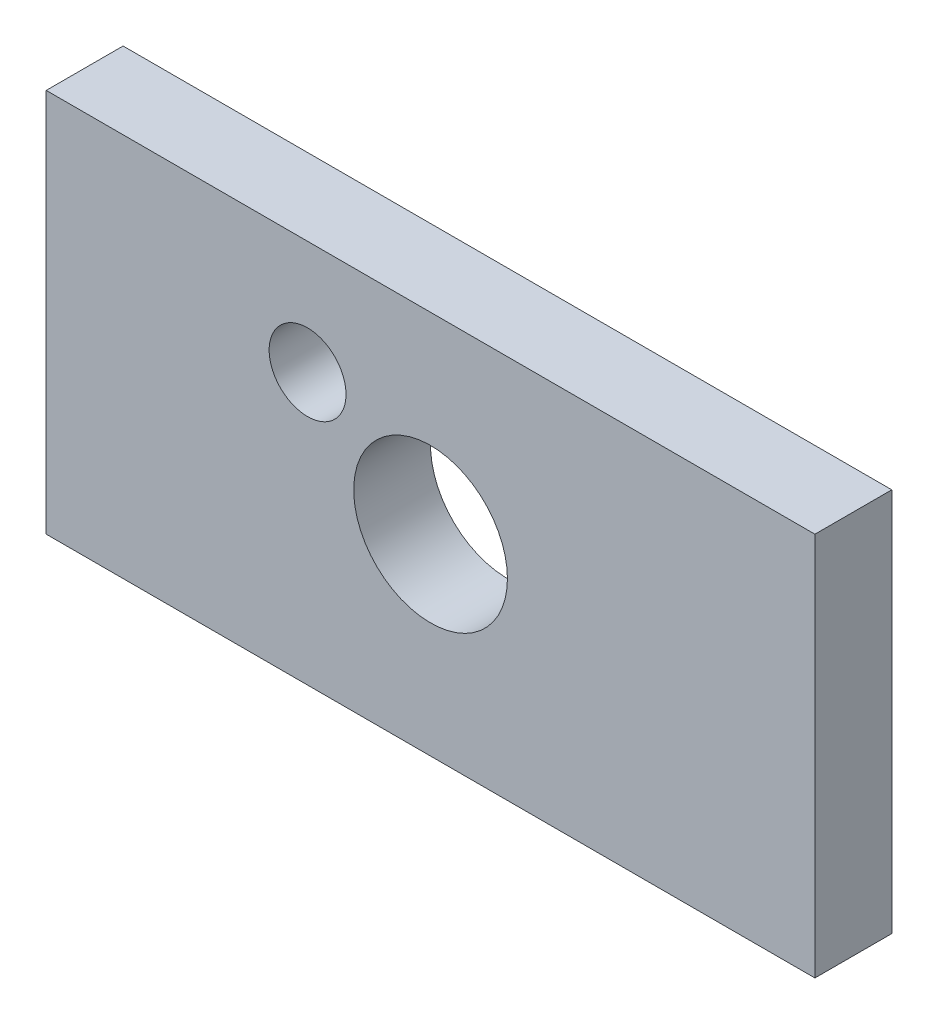
ISO-10303-21;
HEADER;
FILE_DESCRIPTION(('STEP AP214'),'2;1');
FILE_NAME('part.step','',(''),(''),'','','');
FILE_SCHEMA(('AUTOMOTIVE_DESIGN { 1 0 10303 214 1 1 1 1 }'));
ENDSEC;
DATA;
#1=APPLICATION_CONTEXT('core data for automotive mechanical design processes');
#2=APPLICATION_PROTOCOL_DEFINITION('international standard','automotive_design',2000,#1);
#3=PRODUCT_CONTEXT('',#1,'mechanical');
#4=PRODUCT('Part','Part','',(#3));
#5=PRODUCT_RELATED_PRODUCT_CATEGORY('part','',(#4));
#6=PRODUCT_DEFINITION_FORMATION('','',#4);
#7=PRODUCT_DEFINITION_CONTEXT('part definition',#1,'design');
#8=PRODUCT_DEFINITION('design','',#6,#7);
#9=PRODUCT_DEFINITION_SHAPE('','',#8);
#10=(LENGTH_UNIT() NAMED_UNIT(*) SI_UNIT(.MILLI.,.METRE.));
#11=(NAMED_UNIT(*) PLANE_ANGLE_UNIT() SI_UNIT($,.RADIAN.));
#12=(NAMED_UNIT(*) SI_UNIT($,.STERADIAN.) SOLID_ANGLE_UNIT());
#13=UNCERTAINTY_MEASURE_WITH_UNIT(LENGTH_MEASURE(1.E-05),#10,'distance_accuracy_value','');
#14=(GEOMETRIC_REPRESENTATION_CONTEXT(3) GLOBAL_UNCERTAINTY_ASSIGNED_CONTEXT((#13)) GLOBAL_UNIT_ASSIGNED_CONTEXT((#10,
#11,#12)) REPRESENTATION_CONTEXT('',''));
#15=CARTESIAN_POINT('',(0.,0.,0.));
#16=DIRECTION('',(0.,0.,1.));
#17=DIRECTION('',(1.,0.,0.));
#18=AXIS2_PLACEMENT_3D('',#15,#16,#17);
#19=CARTESIAN_POINT('',(0.,0.,10.));
#20=DIRECTION('',(0.,0.,-1.));
#21=DIRECTION('',(-1.,0.,0.));
#22=AXIS2_PLACEMENT_3D('',#19,#20,#21);
#23=PLANE('',#22);
#24=DIRECTION('',(0.,-1.,0.));
#25=VECTOR('',#24,1.);
#26=CARTESIAN_POINT('',(0.,0.,10.));
#27=LINE('',#26,#25);
#28=CARTESIAN_POINT('',(0.,50.,10.));
#29=VERTEX_POINT('',#28);
#30=CARTESIAN_POINT('',(0.,0.,10.));
#31=VERTEX_POINT('',#30);
#32=EDGE_CURVE('E98',#29,#31,#27,.T.);
#33=ORIENTED_EDGE('',*,*,#32,.T.);
#34=DIRECTION('',(1.,0.,0.));
#35=VECTOR('',#34,1.);
#36=CARTESIAN_POINT('',(0.,0.,10.));
#37=LINE('',#36,#35);
#38=CARTESIAN_POINT('',(100.,0.,10.));
#39=VERTEX_POINT('',#38);
#40=EDGE_CURVE('E93',#31,#39,#37,.T.);
#41=ORIENTED_EDGE('',*,*,#40,.T.);
#42=DIRECTION('',(0.,1.,0.));
#43=VECTOR('',#42,1.);
#44=CARTESIAN_POINT('',(100.,0.,10.));
#45=LINE('',#44,#43);
#46=CARTESIAN_POINT('',(100.,50.,10.));
#47=VERTEX_POINT('',#46);
#48=EDGE_CURVE('E96',#39,#47,#45,.T.);
#49=ORIENTED_EDGE('',*,*,#48,.T.);
#50=DIRECTION('',(-1.,0.,0.));
#51=VECTOR('',#50,1.);
#52=CARTESIAN_POINT('',(0.,50.,10.));
#53=LINE('',#52,#51);
#54=EDGE_CURVE('E63',#47,#29,#53,.T.);
#55=ORIENTED_EDGE('',*,*,#54,.T.);
#56=EDGE_LOOP('',(#33,#41,#49,#55));
#57=FACE_BOUND('',#56,.T.);
#58=CARTESIAN_POINT('',(50.,25.,10.));
#59=DIRECTION('',(0.,0.,1.));
#60=DIRECTION('',(1.,0.,0.));
#61=AXIS2_PLACEMENT_3D('',#58,#59,#60);
#62=CIRCLE('',#61,10.);
#63=CARTESIAN_POINT('',(60.,25.,10.));
#64=VERTEX_POINT('',#63);
#65=EDGE_CURVE('E118',#64,#64,#62,.T.);
#66=ORIENTED_EDGE('',*,*,#65,.F.);
#67=EDGE_LOOP('',(#66));
#68=FACE_BOUND('',#67,.T.);
#69=CARTESIAN_POINT('',(34.,35.2469507659596,10.));
#70=DIRECTION('',(0.,0.,1.));
#71=DIRECTION('',(1.,0.,0.));
#72=AXIS2_PLACEMENT_3D('',#69,#70,#71);
#73=CIRCLE('',#72,4.99999999999986);
#74=CARTESIAN_POINT('',(38.9999999999999,35.2469507659596,10.));
#75=VERTEX_POINT('',#74);
#76=EDGE_CURVE('E140',#75,#75,#73,.T.);
#77=ORIENTED_EDGE('',*,*,#76,.F.);
#78=EDGE_LOOP('',(#77));
#79=FACE_BOUND('',#78,.T.);
#80=ADVANCED_FACE('F45',(#57,#68,#79),#23,.F.);
#81=CARTESIAN_POINT('',(0.,0.,0.));
#82=DIRECTION('',(0.,0.,-1.));
#83=DIRECTION('',(-1.,0.,0.));
#84=AXIS2_PLACEMENT_3D('',#81,#82,#83);
#85=PLANE('',#84);
#86=CARTESIAN_POINT('',(50.,25.,0.));
#87=DIRECTION('',(0.,0.,1.));
#88=DIRECTION('',(1.,0.,0.));
#89=AXIS2_PLACEMENT_3D('',#86,#87,#88);
#90=CIRCLE('',#89,10.);
#91=CARTESIAN_POINT('',(60.,25.,0.));
#92=VERTEX_POINT('',#91);
#93=EDGE_CURVE('E136',#92,#92,#90,.T.);
#94=ORIENTED_EDGE('',*,*,#93,.T.);
#95=EDGE_LOOP('',(#94));
#96=FACE_BOUND('',#95,.T.);
#97=DIRECTION('',(0.,-1.,0.));
#98=VECTOR('',#97,1.);
#99=CARTESIAN_POINT('',(0.,0.,0.));
#100=LINE('',#99,#98);
#101=CARTESIAN_POINT('',(0.,50.,0.));
#102=VERTEX_POINT('',#101);
#103=CARTESIAN_POINT('',(0.,0.,0.));
#104=VERTEX_POINT('',#103);
#105=EDGE_CURVE('E114',#102,#104,#100,.T.);
#106=ORIENTED_EDGE('',*,*,#105,.F.);
#107=DIRECTION('',(-1.,0.,0.));
#108=VECTOR('',#107,1.);
#109=CARTESIAN_POINT('',(0.,50.,0.));
#110=LINE('',#109,#108);
#111=CARTESIAN_POINT('',(100.,50.,0.));
#112=VERTEX_POINT('',#111);
#113=EDGE_CURVE('E86',#112,#102,#110,.T.);
#114=ORIENTED_EDGE('',*,*,#113,.F.);
#115=DIRECTION('',(0.,1.,0.));
#116=VECTOR('',#115,1.);
#117=CARTESIAN_POINT('',(100.,0.,0.));
#118=LINE('',#117,#116);
#119=CARTESIAN_POINT('',(100.,0.,0.));
#120=VERTEX_POINT('',#119);
#121=EDGE_CURVE('E80',#120,#112,#118,.T.);
#122=ORIENTED_EDGE('',*,*,#121,.F.);
#123=DIRECTION('',(1.,0.,0.));
#124=VECTOR('',#123,1.);
#125=CARTESIAN_POINT('',(0.,0.,0.));
#126=LINE('',#125,#124);
#127=EDGE_CURVE('E103',#104,#120,#126,.T.);
#128=ORIENTED_EDGE('',*,*,#127,.F.);
#129=EDGE_LOOP('',(#106,#114,#122,#128));
#130=FACE_BOUND('',#129,.T.);
#131=CARTESIAN_POINT('',(34.,35.2469507659596,0.));
#132=DIRECTION('',(0.,0.,1.));
#133=DIRECTION('',(1.,0.,0.));
#134=AXIS2_PLACEMENT_3D('',#131,#132,#133);
#135=CIRCLE('',#134,4.99999999999986);
#136=CARTESIAN_POINT('',(38.9999999999999,35.2469507659596,0.));
#137=VERTEX_POINT('',#136);
#138=EDGE_CURVE('E144',#137,#137,#135,.T.);
#139=ORIENTED_EDGE('',*,*,#138,.T.);
#140=EDGE_LOOP('',(#139));
#141=FACE_BOUND('',#140,.T.);
#142=ADVANCED_FACE('F131',(#96,#130,#141),#85,.T.);
#143=CARTESIAN_POINT('',(0.,0.,10.));
#144=DIRECTION('',(1.,0.,0.));
#145=DIRECTION('',(0.,0.,-1.));
#146=AXIS2_PLACEMENT_3D('',#143,#144,#145);
#147=PLANE('',#146);
#148=ORIENTED_EDGE('',*,*,#105,.T.);
#149=DIRECTION('',(0.,0.,-1.));
#150=VECTOR('',#149,1.);
#151=CARTESIAN_POINT('',(0.,0.,10.));
#152=LINE('',#151,#150);
#153=EDGE_CURVE('E11',#31,#104,#152,.T.);
#154=ORIENTED_EDGE('',*,*,#153,.F.);
#155=ORIENTED_EDGE('',*,*,#32,.F.);
#156=DIRECTION('',(0.,0.,-1.));
#157=VECTOR('',#156,1.);
#158=CARTESIAN_POINT('',(0.,50.,10.));
#159=LINE('',#158,#157);
#160=EDGE_CURVE('E110',#29,#102,#159,.T.);
#161=ORIENTED_EDGE('',*,*,#160,.T.);
#162=EDGE_LOOP('',(#148,#154,#155,#161));
#163=FACE_BOUND('',#162,.T.);
#164=ADVANCED_FACE('F47',(#163),#147,.F.);
#165=CARTESIAN_POINT('',(0.,0.,10.));
#166=DIRECTION('',(0.,1.,0.));
#167=DIRECTION('',(0.,0.,1.));
#168=AXIS2_PLACEMENT_3D('',#165,#166,#167);
#169=PLANE('',#168);
#170=ORIENTED_EDGE('',*,*,#127,.T.);
#171=DIRECTION('',(0.,0.,-1.));
#172=VECTOR('',#171,1.);
#173=CARTESIAN_POINT('',(100.,0.,10.));
#174=LINE('',#173,#172);
#175=EDGE_CURVE('E55',#39,#120,#174,.T.);
#176=ORIENTED_EDGE('',*,*,#175,.F.);
#177=ORIENTED_EDGE('',*,*,#40,.F.);
#178=ORIENTED_EDGE('',*,*,#153,.T.);
#179=EDGE_LOOP('',(#170,#176,#177,#178));
#180=FACE_BOUND('',#179,.T.);
#181=ADVANCED_FACE('F102',(#180),#169,.F.);
#182=CARTESIAN_POINT('',(100.,0.,10.));
#183=DIRECTION('',(-1.,0.,0.));
#184=DIRECTION('',(0.,0.,1.));
#185=AXIS2_PLACEMENT_3D('',#182,#183,#184);
#186=PLANE('',#185);
#187=ORIENTED_EDGE('',*,*,#121,.T.);
#188=DIRECTION('',(0.,0.,-1.));
#189=VECTOR('',#188,1.);
#190=CARTESIAN_POINT('',(100.,50.,10.));
#191=LINE('',#190,#189);
#192=EDGE_CURVE('E105',#47,#112,#191,.T.);
#193=ORIENTED_EDGE('',*,*,#192,.F.);
#194=ORIENTED_EDGE('',*,*,#48,.F.);
#195=ORIENTED_EDGE('',*,*,#175,.T.);
#196=EDGE_LOOP('',(#187,#193,#194,#195));
#197=FACE_BOUND('',#196,.T.);
#198=ADVANCED_FACE('F106',(#197),#186,.F.);
#199=CARTESIAN_POINT('',(0.,50.,10.));
#200=DIRECTION('',(0.,-1.,0.));
#201=DIRECTION('',(0.,0.,-1.));
#202=AXIS2_PLACEMENT_3D('',#199,#200,#201);
#203=PLANE('',#202);
#204=ORIENTED_EDGE('',*,*,#113,.T.);
#205=ORIENTED_EDGE('',*,*,#160,.F.);
#206=ORIENTED_EDGE('',*,*,#54,.F.);
#207=ORIENTED_EDGE('',*,*,#192,.T.);
#208=EDGE_LOOP('',(#204,#205,#206,#207));
#209=FACE_BOUND('',#208,.T.);
#210=ADVANCED_FACE('F128',(#209),#203,.F.);
#211=CARTESIAN_POINT('',(50.,25.,10.));
#212=DIRECTION('',(0.,0.,-1.));
#213=DIRECTION('',(-1.,0.,0.));
#214=AXIS2_PLACEMENT_3D('',#211,#212,#213);
#215=CYLINDRICAL_SURFACE('',#214,10.);
#216=ORIENTED_EDGE('',*,*,#65,.T.);
#217=EDGE_LOOP('',(#216));
#218=FACE_BOUND('',#217,.T.);
#219=ORIENTED_EDGE('',*,*,#93,.F.);
#220=EDGE_LOOP('',(#219));
#221=FACE_BOUND('',#220,.T.);
#222=ADVANCED_FACE('F163',(#218,#221),#215,.F.);
#223=CARTESIAN_POINT('',(34.,35.2469507659596,10.));
#224=DIRECTION('',(0.,0.,-1.));
#225=DIRECTION('',(-1.,0.,0.));
#226=AXIS2_PLACEMENT_3D('',#223,#224,#225);
#227=CYLINDRICAL_SURFACE('',#226,4.99999999999986);
#228=ORIENTED_EDGE('',*,*,#76,.T.);
#229=EDGE_LOOP('',(#228));
#230=FACE_BOUND('',#229,.T.);
#231=ORIENTED_EDGE('',*,*,#138,.F.);
#232=EDGE_LOOP('',(#231));
#233=FACE_BOUND('',#232,.T.);
#234=ADVANCED_FACE('F152',(#230,#233),#227,.F.);
#235=CLOSED_SHELL('',(#80,#142,#164,#181,#198,#210,#222,#234));
#236=MANIFOLD_SOLID_BREP('B2',#235);
#237=ADVANCED_BREP_SHAPE_REPRESENTATION('',(#18,#236),#14);
#238=SHAPE_DEFINITION_REPRESENTATION(#9,#237);
ENDSEC;
END-ISO-10303-21;
